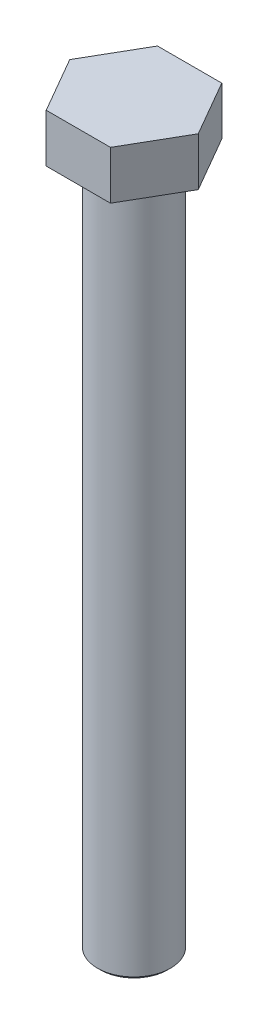
ISO-10303-21;
HEADER;
FILE_DESCRIPTION(('STEP AP214'),'2;1');
FILE_NAME('part.step','',(''),(''),'','','');
FILE_SCHEMA(('AUTOMOTIVE_DESIGN { 1 0 10303 214 1 1 1 1 }'));
ENDSEC;
DATA;
#1=APPLICATION_CONTEXT('core data for automotive mechanical design processes');
#2=APPLICATION_PROTOCOL_DEFINITION('international standard','automotive_design',2000,#1);
#3=PRODUCT_CONTEXT('',#1,'mechanical');
#4=PRODUCT('Part','Part','',(#3));
#5=PRODUCT_RELATED_PRODUCT_CATEGORY('part','',(#4));
#6=PRODUCT_DEFINITION_FORMATION('','',#4);
#7=PRODUCT_DEFINITION_CONTEXT('part definition',#1,'design');
#8=PRODUCT_DEFINITION('design','',#6,#7);
#9=PRODUCT_DEFINITION_SHAPE('','',#8);
#10=(LENGTH_UNIT() NAMED_UNIT(*) SI_UNIT(.MILLI.,.METRE.));
#11=(NAMED_UNIT(*) PLANE_ANGLE_UNIT() SI_UNIT($,.RADIAN.));
#12=(NAMED_UNIT(*) SI_UNIT($,.STERADIAN.) SOLID_ANGLE_UNIT());
#13=UNCERTAINTY_MEASURE_WITH_UNIT(LENGTH_MEASURE(1.E-05),#10,'distance_accuracy_value','');
#14=(GEOMETRIC_REPRESENTATION_CONTEXT(3) GLOBAL_UNCERTAINTY_ASSIGNED_CONTEXT((#13)) GLOBAL_UNIT_ASSIGNED_CONTEXT((#10,
#11,#12)) REPRESENTATION_CONTEXT('',''));
#15=CARTESIAN_POINT('',(0.,0.,0.));
#16=DIRECTION('',(0.,0.,1.));
#17=DIRECTION('',(1.,0.,0.));
#18=AXIS2_PLACEMENT_3D('',#15,#16,#17);
#19=CARTESIAN_POINT('',(8.2635566678842,-6.223,0.));
#20=DIRECTION('',(0.,1.,0.));
#21=DIRECTION('',(0.,0.,1.));
#22=AXIS2_PLACEMENT_3D('',#19,#20,#21);
#23=PLANE('',#22);
#24=DIRECTION('',(0.5,0.,-0.866025403784439));
#25=VECTOR('',#24,1.);
#26=CARTESIAN_POINT('',(4.1317783339421,-6.223,7.15645));
#27=LINE('',#26,#25);
#28=CARTESIAN_POINT('',(4.1317783339421,-6.223,7.15645));
#29=VERTEX_POINT('',#28);
#30=CARTESIAN_POINT('',(8.2635566678842,-6.223,0.));
#31=VERTEX_POINT('',#30);
#32=EDGE_CURVE('E133',#29,#31,#27,.T.);
#33=ORIENTED_EDGE('',*,*,#32,.F.);
#34=DIRECTION('',(1.,0.,0.));
#35=VECTOR('',#34,1.);
#36=CARTESIAN_POINT('',(-4.1317783339421,-6.223,7.15645));
#37=LINE('',#36,#35);
#38=CARTESIAN_POINT('',(-4.1317783339421,-6.223,7.15645));
#39=VERTEX_POINT('',#38);
#40=EDGE_CURVE('E108',#39,#29,#37,.T.);
#41=ORIENTED_EDGE('',*,*,#40,.F.);
#42=DIRECTION('',(0.5,0.,0.866025403784438));
#43=VECTOR('',#42,1.);
#44=CARTESIAN_POINT('',(-8.2635566678842,-6.223,0.));
#45=LINE('',#44,#43);
#46=CARTESIAN_POINT('',(-8.2635566678842,-6.223,0.));
#47=VERTEX_POINT('',#46);
#48=EDGE_CURVE('E93',#47,#39,#45,.T.);
#49=ORIENTED_EDGE('',*,*,#48,.F.);
#50=DIRECTION('',(-0.5,0.,0.866025403784439));
#51=VECTOR('',#50,1.);
#52=CARTESIAN_POINT('',(-4.1317783339421,-6.223,-7.15645));
#53=LINE('',#52,#51);
#54=CARTESIAN_POINT('',(-4.1317783339421,-6.223,-7.15645));
#55=VERTEX_POINT('',#54);
#56=EDGE_CURVE('E106',#55,#47,#53,.T.);
#57=ORIENTED_EDGE('',*,*,#56,.F.);
#58=DIRECTION('',(-1.,0.,0.));
#59=VECTOR('',#58,1.);
#60=CARTESIAN_POINT('',(4.1317783339421,-6.223,-7.15645));
#61=LINE('',#60,#59);
#62=CARTESIAN_POINT('',(4.1317783339421,-6.223,-7.15645));
#63=VERTEX_POINT('',#62);
#64=EDGE_CURVE('E111',#63,#55,#61,.T.);
#65=ORIENTED_EDGE('',*,*,#64,.F.);
#66=DIRECTION('',(-0.5,0.,-0.866025403784438));
#67=VECTOR('',#66,1.);
#68=CARTESIAN_POINT('',(8.2635566678842,-6.223,0.));
#69=LINE('',#68,#67);
#70=EDGE_CURVE('E113',#31,#63,#69,.T.);
#71=ORIENTED_EDGE('',*,*,#70,.F.);
#72=EDGE_LOOP('',(#33,#41,#49,#57,#65,#71));
#73=FACE_BOUND('',#72,.T.);
#74=CARTESIAN_POINT('',(0.,-6.22300000000001,0.));
#75=DIRECTION('',(0.,1.,0.));
#76=DIRECTION('',(0.,0.,1.));
#77=AXIS2_PLACEMENT_3D('',#74,#75,#76);
#78=CIRCLE('',#77,4.699);
#79=CARTESIAN_POINT('',(0.,-6.22300000000001,4.699));
#80=VERTEX_POINT('',#79);
#81=EDGE_CURVE('E135',#80,#80,#78,.F.);
#82=ORIENTED_EDGE('',*,*,#81,.F.);
#83=EDGE_LOOP('',(#82));
#84=FACE_BOUND('',#83,.T.);
#85=ADVANCED_FACE('F30',(#73,#84),#23,.F.);
#86=CARTESIAN_POINT('',(4.1317783339421,-6.223,7.15645));
#87=DIRECTION('',(0.866025403784438,0.,0.5));
#88=DIRECTION('',(0.5,0.,-0.866025403784439));
#89=AXIS2_PLACEMENT_3D('',#86,#87,#88);
#90=PLANE('',#89);
#91=DIRECTION('',(0.5,0.,-0.866025403784439));
#92=VECTOR('',#91,1.);
#93=CARTESIAN_POINT('',(4.1317783339421,0.,7.15645));
#94=LINE('',#93,#92);
#95=CARTESIAN_POINT('',(4.1317783339421,0.,7.15645));
#96=VERTEX_POINT('',#95);
#97=CARTESIAN_POINT('',(8.2635566678842,0.,0.));
#98=VERTEX_POINT('',#97);
#99=EDGE_CURVE('E118',#96,#98,#94,.T.);
#100=ORIENTED_EDGE('',*,*,#99,.F.);
#101=DIRECTION('',(0.,1.,0.));
#102=VECTOR('',#101,1.);
#103=CARTESIAN_POINT('',(4.1317783339421,-6.223,7.15645));
#104=LINE('',#103,#102);
#105=EDGE_CURVE('E47',#29,#96,#104,.T.);
#106=ORIENTED_EDGE('',*,*,#105,.F.);
#107=ORIENTED_EDGE('',*,*,#32,.T.);
#108=DIRECTION('',(0.,1.,0.));
#109=VECTOR('',#108,1.);
#110=CARTESIAN_POINT('',(8.2635566678842,-6.223,0.));
#111=LINE('',#110,#109);
#112=EDGE_CURVE('E82',#31,#98,#111,.T.);
#113=ORIENTED_EDGE('',*,*,#112,.T.);
#114=EDGE_LOOP('',(#100,#106,#107,#113));
#115=FACE_BOUND('',#114,.T.);
#116=ADVANCED_FACE('F156',(#115),#90,.T.);
#117=CARTESIAN_POINT('',(-4.1317783339421,-6.223,7.15645));
#118=DIRECTION('',(0.,0.,1.));
#119=DIRECTION('',(1.,0.,0.));
#120=AXIS2_PLACEMENT_3D('',#117,#118,#119);
#121=PLANE('',#120);
#122=DIRECTION('',(1.,0.,0.));
#123=VECTOR('',#122,1.);
#124=CARTESIAN_POINT('',(-4.1317783339421,0.,7.15645));
#125=LINE('',#124,#123);
#126=CARTESIAN_POINT('',(-4.1317783339421,0.,7.15645));
#127=VERTEX_POINT('',#126);
#128=EDGE_CURVE('E130',#127,#96,#125,.T.);
#129=ORIENTED_EDGE('',*,*,#128,.F.);
#130=DIRECTION('',(0.,1.,0.));
#131=VECTOR('',#130,1.);
#132=CARTESIAN_POINT('',(-4.1317783339421,-6.223,7.15645));
#133=LINE('',#132,#131);
#134=EDGE_CURVE('E70',#39,#127,#133,.T.);
#135=ORIENTED_EDGE('',*,*,#134,.F.);
#136=ORIENTED_EDGE('',*,*,#40,.T.);
#137=ORIENTED_EDGE('',*,*,#105,.T.);
#138=EDGE_LOOP('',(#129,#135,#136,#137));
#139=FACE_BOUND('',#138,.T.);
#140=ADVANCED_FACE('F161',(#139),#121,.T.);
#141=CARTESIAN_POINT('',(-8.2635566678842,-6.223,0.));
#142=DIRECTION('',(-0.866025403784438,0.,0.5));
#143=DIRECTION('',(0.5,0.,0.866025403784439));
#144=AXIS2_PLACEMENT_3D('',#141,#142,#143);
#145=PLANE('',#144);
#146=DIRECTION('',(0.5,0.,0.866025403784438));
#147=VECTOR('',#146,1.);
#148=CARTESIAN_POINT('',(-8.2635566678842,0.,0.));
#149=LINE('',#148,#147);
#150=CARTESIAN_POINT('',(-8.2635566678842,0.,0.));
#151=VERTEX_POINT('',#150);
#152=EDGE_CURVE('E95',#151,#127,#149,.T.);
#153=ORIENTED_EDGE('',*,*,#152,.F.);
#154=DIRECTION('',(0.,1.,0.));
#155=VECTOR('',#154,1.);
#156=CARTESIAN_POINT('',(-8.2635566678842,-6.223,0.));
#157=LINE('',#156,#155);
#158=EDGE_CURVE('E90',#47,#151,#157,.T.);
#159=ORIENTED_EDGE('',*,*,#158,.F.);
#160=ORIENTED_EDGE('',*,*,#48,.T.);
#161=ORIENTED_EDGE('',*,*,#134,.T.);
#162=EDGE_LOOP('',(#153,#159,#160,#161));
#163=FACE_BOUND('',#162,.T.);
#164=ADVANCED_FACE('F92',(#163),#145,.T.);
#165=CARTESIAN_POINT('',(-4.1317783339421,-6.223,-7.15645));
#166=DIRECTION('',(-0.866025403784438,0.,-0.5));
#167=DIRECTION('',(-0.5,0.,0.866025403784439));
#168=AXIS2_PLACEMENT_3D('',#165,#166,#167);
#169=PLANE('',#168);
#170=DIRECTION('',(-0.5,0.,0.866025403784439));
#171=VECTOR('',#170,1.);
#172=CARTESIAN_POINT('',(-4.1317783339421,0.,-7.15645));
#173=LINE('',#172,#171);
#174=CARTESIAN_POINT('',(-4.1317783339421,0.,-7.15645));
#175=VERTEX_POINT('',#174);
#176=EDGE_CURVE('E127',#175,#151,#173,.T.);
#177=ORIENTED_EDGE('',*,*,#176,.F.);
#178=DIRECTION('',(0.,1.,0.));
#179=VECTOR('',#178,1.);
#180=CARTESIAN_POINT('',(-4.1317783339421,-6.223,-7.15645));
#181=LINE('',#180,#179);
#182=EDGE_CURVE('E100',#55,#175,#181,.T.);
#183=ORIENTED_EDGE('',*,*,#182,.F.);
#184=ORIENTED_EDGE('',*,*,#56,.T.);
#185=ORIENTED_EDGE('',*,*,#158,.T.);
#186=EDGE_LOOP('',(#177,#183,#184,#185));
#187=FACE_BOUND('',#186,.T.);
#188=ADVANCED_FACE('F110',(#187),#169,.T.);
#189=CARTESIAN_POINT('',(4.1317783339421,-6.223,-7.15645));
#190=DIRECTION('',(0.,0.,-1.));
#191=DIRECTION('',(-1.,0.,0.));
#192=AXIS2_PLACEMENT_3D('',#189,#190,#191);
#193=PLANE('',#192);
#194=DIRECTION('',(-1.,0.,0.));
#195=VECTOR('',#194,1.);
#196=CARTESIAN_POINT('',(4.1317783339421,0.,-7.15645));
#197=LINE('',#196,#195);
#198=CARTESIAN_POINT('',(4.1317783339421,0.,-7.15645));
#199=VERTEX_POINT('',#198);
#200=EDGE_CURVE('E124',#199,#175,#197,.T.);
#201=ORIENTED_EDGE('',*,*,#200,.F.);
#202=DIRECTION('',(0.,1.,0.));
#203=VECTOR('',#202,1.);
#204=CARTESIAN_POINT('',(4.1317783339421,-6.223,-7.15645));
#205=LINE('',#204,#203);
#206=EDGE_CURVE('E138',#63,#199,#205,.T.);
#207=ORIENTED_EDGE('',*,*,#206,.F.);
#208=ORIENTED_EDGE('',*,*,#64,.T.);
#209=ORIENTED_EDGE('',*,*,#182,.T.);
#210=EDGE_LOOP('',(#201,#207,#208,#209));
#211=FACE_BOUND('',#210,.T.);
#212=ADVANCED_FACE('F175',(#211),#193,.T.);
#213=CARTESIAN_POINT('',(8.2635566678842,-6.223,0.));
#214=DIRECTION('',(0.866025403784438,0.,-0.5));
#215=DIRECTION('',(-0.5,0.,-0.866025403784439));
#216=AXIS2_PLACEMENT_3D('',#213,#214,#215);
#217=PLANE('',#216);
#218=DIRECTION('',(-0.5,0.,-0.866025403784438));
#219=VECTOR('',#218,1.);
#220=CARTESIAN_POINT('',(8.2635566678842,0.,0.));
#221=LINE('',#220,#219);
#222=EDGE_CURVE('E121',#98,#199,#221,.T.);
#223=ORIENTED_EDGE('',*,*,#222,.F.);
#224=ORIENTED_EDGE('',*,*,#112,.F.);
#225=ORIENTED_EDGE('',*,*,#70,.T.);
#226=ORIENTED_EDGE('',*,*,#206,.T.);
#227=EDGE_LOOP('',(#223,#224,#225,#226));
#228=FACE_BOUND('',#227,.T.);
#229=ADVANCED_FACE('F167',(#228),#217,.T.);
#230=CARTESIAN_POINT('',(8.2635566678842,0.,0.));
#231=DIRECTION('',(0.,1.,0.));
#232=DIRECTION('',(0.,0.,1.));
#233=AXIS2_PLACEMENT_3D('',#230,#231,#232);
#234=PLANE('',#233);
#235=ORIENTED_EDGE('',*,*,#99,.T.);
#236=ORIENTED_EDGE('',*,*,#222,.T.);
#237=ORIENTED_EDGE('',*,*,#200,.T.);
#238=ORIENTED_EDGE('',*,*,#176,.T.);
#239=ORIENTED_EDGE('',*,*,#152,.T.);
#240=ORIENTED_EDGE('',*,*,#128,.T.);
#241=EDGE_LOOP('',(#235,#236,#237,#238,#239,#240));
#242=FACE_BOUND('',#241,.T.);
#243=ADVANCED_FACE('F164',(#242),#234,.T.);
#244=CARTESIAN_POINT('',(0.,-95.123,0.));
#245=DIRECTION('',(0.,1.,0.));
#246=DIRECTION('',(0.,0.,1.));
#247=AXIS2_PLACEMENT_3D('',#244,#245,#246);
#248=CYLINDRICAL_SURFACE('',#247,4.699);
#249=CARTESIAN_POINT('',(0.,-94.7268,0.));
#250=DIRECTION('',(0.,-1.,0.));
#251=DIRECTION('',(0.,0.,-1.));
#252=AXIS2_PLACEMENT_3D('',#249,#250,#251);
#253=CIRCLE('',#252,4.699);
#254=CARTESIAN_POINT('',(0.,-94.7268,-4.699));
#255=VERTEX_POINT('',#254);
#256=EDGE_CURVE('E11',#255,#255,#253,.F.);
#257=ORIENTED_EDGE('',*,*,#256,.T.);
#258=EDGE_LOOP('',(#257));
#259=FACE_BOUND('',#258,.T.);
#260=ORIENTED_EDGE('',*,*,#81,.T.);
#261=EDGE_LOOP('',(#260));
#262=FACE_BOUND('',#261,.T.);
#263=ADVANCED_FACE('F152',(#259,#262),#248,.T.);
#264=CARTESIAN_POINT('',(0.,-95.123,0.));
#265=DIRECTION('',(0.,-1.,0.));
#266=DIRECTION('',(0.,0.,-1.));
#267=AXIS2_PLACEMENT_3D('',#264,#265,#266);
#268=PLANE('',#267);
#269=CARTESIAN_POINT('',(0.,-95.123,0.));
#270=DIRECTION('',(0.,-1.,0.));
#271=DIRECTION('',(0.,0.,-1.));
#272=AXIS2_PLACEMENT_3D('',#269,#270,#271);
#273=CIRCLE('',#272,4.3028);
#274=CARTESIAN_POINT('',(0.,-95.123,-4.3028));
#275=VERTEX_POINT('',#274);
#276=EDGE_CURVE('E39',#275,#275,#273,.T.);
#277=ORIENTED_EDGE('',*,*,#276,.T.);
#278=EDGE_LOOP('',(#277));
#279=FACE_BOUND('',#278,.T.);
#280=ADVANCED_FACE('F145',(#279),#268,.T.);
#281=CARTESIAN_POINT('',(0.,-95.123,0.));
#282=DIRECTION('',(0.,1.,0.));
#283=DIRECTION('',(0.,0.,1.));
#284=AXIS2_PLACEMENT_3D('',#281,#282,#283);
#285=CONICAL_SURFACE('',#284,4.3028,0.785398163397455);
#286=ORIENTED_EDGE('',*,*,#256,.F.);
#287=EDGE_LOOP('',(#286));
#288=FACE_BOUND('',#287,.T.);
#289=ORIENTED_EDGE('',*,*,#276,.F.);
#290=EDGE_LOOP('',(#289));
#291=FACE_BOUND('',#290,.T.);
#292=ADVANCED_FACE('F32',(#288,#291),#285,.T.);
#293=CLOSED_SHELL('',(#85,#116,#140,#164,#188,#212,#229,#243,#263,#280,#292));
#294=MANIFOLD_SOLID_BREP('B2',#293);
#295=ADVANCED_BREP_SHAPE_REPRESENTATION('',(#18,#294),#14);
#296=SHAPE_DEFINITION_REPRESENTATION(#9,#295);
ENDSEC;
END-ISO-10303-21;
